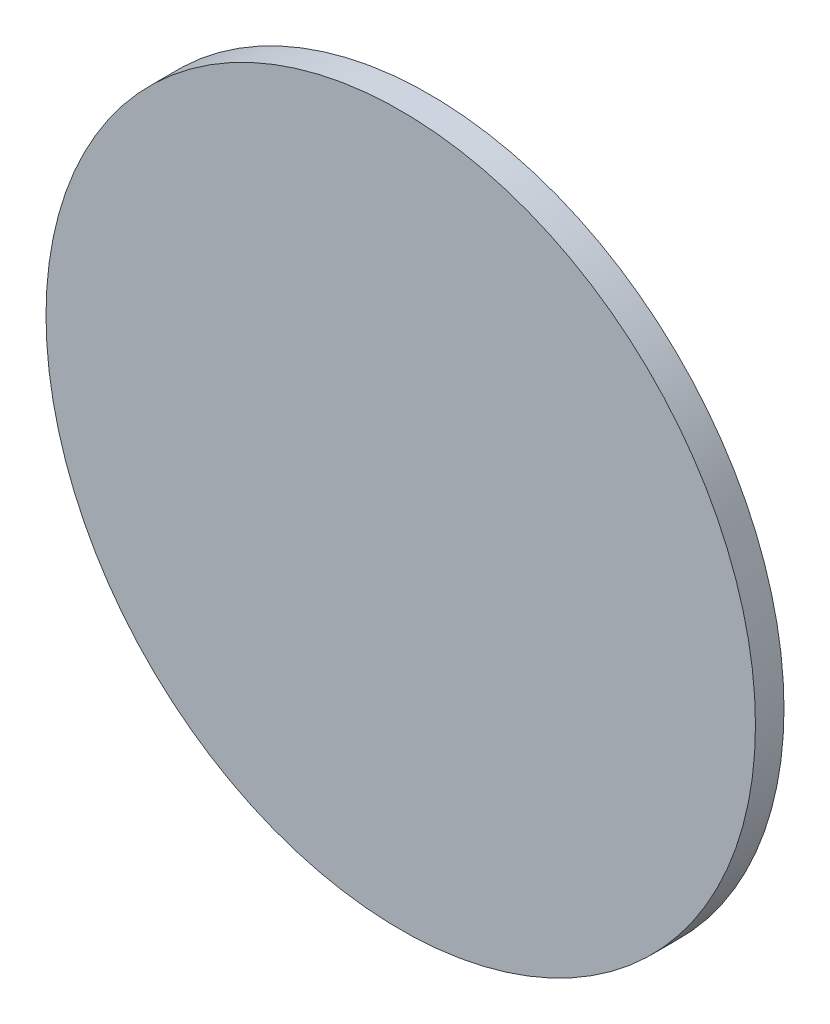
ISO-10303-21;
HEADER;
FILE_DESCRIPTION(('STEP AP214'),'2;1');
FILE_NAME('part.step','',(''),(''),'','','');
FILE_SCHEMA(('AUTOMOTIVE_DESIGN { 1 0 10303 214 1 1 1 1 }'));
ENDSEC;
DATA;
#1=APPLICATION_CONTEXT('core data for automotive mechanical design processes');
#2=APPLICATION_PROTOCOL_DEFINITION('international standard','automotive_design',2000,#1);
#3=PRODUCT_CONTEXT('',#1,'mechanical');
#4=PRODUCT('Part','Part','',(#3));
#5=PRODUCT_RELATED_PRODUCT_CATEGORY('part','',(#4));
#6=PRODUCT_DEFINITION_FORMATION('','',#4);
#7=PRODUCT_DEFINITION_CONTEXT('part definition',#1,'design');
#8=PRODUCT_DEFINITION('design','',#6,#7);
#9=PRODUCT_DEFINITION_SHAPE('','',#8);
#10=(LENGTH_UNIT() NAMED_UNIT(*) SI_UNIT(.MILLI.,.METRE.));
#11=(NAMED_UNIT(*) PLANE_ANGLE_UNIT() SI_UNIT($,.RADIAN.));
#12=(NAMED_UNIT(*) SI_UNIT($,.STERADIAN.) SOLID_ANGLE_UNIT());
#13=UNCERTAINTY_MEASURE_WITH_UNIT(LENGTH_MEASURE(1.E-05),#10,'distance_accuracy_value','');
#14=(GEOMETRIC_REPRESENTATION_CONTEXT(3) GLOBAL_UNCERTAINTY_ASSIGNED_CONTEXT((#13)) GLOBAL_UNIT_ASSIGNED_CONTEXT((#10,
#11,#12)) REPRESENTATION_CONTEXT('',''));
#15=CARTESIAN_POINT('',(0.,0.,0.));
#16=DIRECTION('',(0.,0.,1.));
#17=DIRECTION('',(1.,0.,0.));
#18=AXIS2_PLACEMENT_3D('',#15,#16,#17);
#19=CARTESIAN_POINT('',(0.,0.,2.));
#20=DIRECTION('',(0.,0.,-1.));
#21=DIRECTION('',(-1.,0.,0.));
#22=AXIS2_PLACEMENT_3D('',#19,#20,#21);
#23=CYLINDRICAL_SURFACE('',#22,24.875);
#24=CARTESIAN_POINT('',(0.,0.,2.));
#25=DIRECTION('',(0.,0.,1.));
#26=DIRECTION('',(1.,0.,0.));
#27=AXIS2_PLACEMENT_3D('',#24,#25,#26);
#28=CIRCLE('',#27,24.875);
#29=CARTESIAN_POINT('',(24.875,0.,2.));
#30=VERTEX_POINT('',#29);
#31=EDGE_CURVE('E10',#30,#30,#28,.T.);
#32=ORIENTED_EDGE('',*,*,#31,.F.);
#33=EDGE_LOOP('',(#32));
#34=FACE_BOUND('',#33,.T.);
#35=CARTESIAN_POINT('',(0.,0.,0.));
#36=DIRECTION('',(0.,0.,1.));
#37=DIRECTION('',(1.,0.,0.));
#38=AXIS2_PLACEMENT_3D('',#35,#36,#37);
#39=CIRCLE('',#38,24.875);
#40=CARTESIAN_POINT('',(24.875,0.,0.));
#41=VERTEX_POINT('',#40);
#42=EDGE_CURVE('E40',#41,#41,#39,.T.);
#43=ORIENTED_EDGE('',*,*,#42,.T.);
#44=EDGE_LOOP('',(#43));
#45=FACE_BOUND('',#44,.T.);
#46=ADVANCED_FACE('F37',(#34,#45),#23,.T.);
#47=CARTESIAN_POINT('',(0.,0.,2.));
#48=DIRECTION('',(0.,0.,1.));
#49=DIRECTION('',(1.,0.,0.));
#50=AXIS2_PLACEMENT_3D('',#47,#48,#49);
#51=PLANE('',#50);
#52=ORIENTED_EDGE('',*,*,#31,.T.);
#53=EDGE_LOOP('',(#52));
#54=FACE_BOUND('',#53,.T.);
#55=ADVANCED_FACE('F54',(#54),#51,.T.);
#56=CARTESIAN_POINT('',(0.,0.,0.));
#57=DIRECTION('',(0.,0.,1.));
#58=DIRECTION('',(1.,0.,0.));
#59=AXIS2_PLACEMENT_3D('',#56,#57,#58);
#60=PLANE('',#59);
#61=ORIENTED_EDGE('',*,*,#42,.F.);
#62=EDGE_LOOP('',(#61));
#63=FACE_BOUND('',#62,.T.);
#64=ADVANCED_FACE('F52',(#63),#60,.F.);
#65=CLOSED_SHELL('',(#46,#55,#64));
#66=MANIFOLD_SOLID_BREP('B2',#65);
#67=ADVANCED_BREP_SHAPE_REPRESENTATION('',(#18,#66),#14);
#68=SHAPE_DEFINITION_REPRESENTATION(#9,#67);
ENDSEC;
END-ISO-10303-21;
